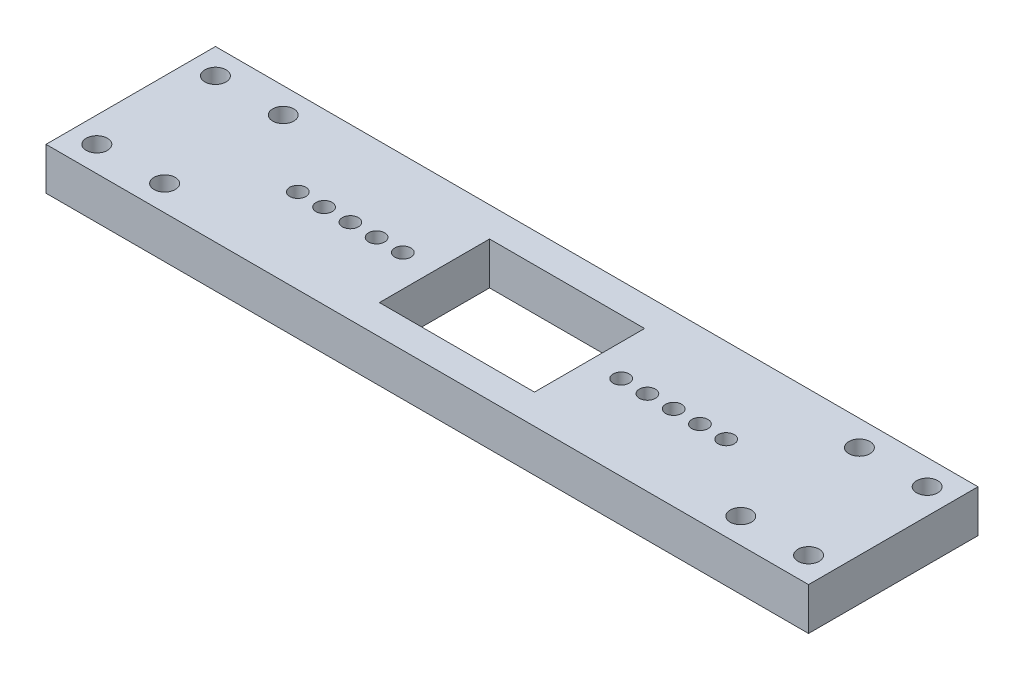
ISO-10303-21;
HEADER;
FILE_DESCRIPTION(('STEP AP214'),'2;1');
FILE_NAME('part.step','',(''),(''),'','','');
FILE_SCHEMA(('AUTOMOTIVE_DESIGN { 1 0 10303 214 1 1 1 1 }'));
ENDSEC;
DATA;
#1=APPLICATION_CONTEXT('core data for automotive mechanical design processes');
#2=APPLICATION_PROTOCOL_DEFINITION('international standard','automotive_design',2000,#1);
#3=PRODUCT_CONTEXT('',#1,'mechanical');
#4=PRODUCT('Part','Part','',(#3));
#5=PRODUCT_RELATED_PRODUCT_CATEGORY('part','',(#4));
#6=PRODUCT_DEFINITION_FORMATION('','',#4);
#7=PRODUCT_DEFINITION_CONTEXT('part definition',#1,'design');
#8=PRODUCT_DEFINITION('design','',#6,#7);
#9=PRODUCT_DEFINITION_SHAPE('','',#8);
#10=(LENGTH_UNIT() NAMED_UNIT(*) SI_UNIT(.MILLI.,.METRE.));
#11=(NAMED_UNIT(*) PLANE_ANGLE_UNIT() SI_UNIT($,.RADIAN.));
#12=(NAMED_UNIT(*) SI_UNIT($,.STERADIAN.) SOLID_ANGLE_UNIT());
#13=UNCERTAINTY_MEASURE_WITH_UNIT(LENGTH_MEASURE(1.E-05),#10,'distance_accuracy_value','');
#14=(GEOMETRIC_REPRESENTATION_CONTEXT(3) GLOBAL_UNCERTAINTY_ASSIGNED_CONTEXT((#13)) GLOBAL_UNIT_ASSIGNED_CONTEXT((#10,
#11,#12)) REPRESENTATION_CONTEXT('',''));
#15=CARTESIAN_POINT('',(0.,0.,0.));
#16=DIRECTION('',(0.,0.,1.));
#17=DIRECTION('',(1.,0.,0.));
#18=AXIS2_PLACEMENT_3D('',#15,#16,#17);
#19=CARTESIAN_POINT('',(0.,5.,0.));
#20=DIRECTION('',(0.,-1.,0.));
#21=DIRECTION('',(0.,0.,-1.));
#22=AXIS2_PLACEMENT_3D('',#19,#20,#21);
#23=PLANE('',#22);
#24=CARTESIAN_POINT('',(3.,5.,-17.));
#25=DIRECTION('',(0.,1.,0.));
#26=DIRECTION('',(0.,0.,1.));
#27=AXIS2_PLACEMENT_3D('',#24,#25,#26);
#28=CIRCLE('',#27,1.25);
#29=CARTESIAN_POINT('',(3.,5.,-15.75));
#30=VERTEX_POINT('',#29);
#31=EDGE_CURVE('E300',#30,#30,#28,.T.);
#32=ORIENTED_EDGE('',*,*,#31,.F.);
#33=EDGE_LOOP('',(#32));
#34=FACE_BOUND('',#33,.T.);
#35=CARTESIAN_POINT('',(87.,5.,-17.));
#36=DIRECTION('',(0.,1.,0.));
#37=DIRECTION('',(0.,0.,-1.));
#38=AXIS2_PLACEMENT_3D('',#35,#36,#37);
#39=CIRCLE('',#38,1.25);
#40=CARTESIAN_POINT('',(87.,5.,-18.25));
#41=VERTEX_POINT('',#40);
#42=EDGE_CURVE('E316',#41,#41,#39,.T.);
#43=ORIENTED_EDGE('',*,*,#42,.F.);
#44=EDGE_LOOP('',(#43));
#45=FACE_BOUND('',#44,.T.);
#46=CARTESIAN_POINT('',(79.,5.,-17.));
#47=DIRECTION('',(0.,1.,0.));
#48=DIRECTION('',(0.,0.,-1.));
#49=AXIS2_PLACEMENT_3D('',#46,#47,#48);
#50=CIRCLE('',#49,1.25);
#51=CARTESIAN_POINT('',(79.,5.,-18.25));
#52=VERTEX_POINT('',#51);
#53=EDGE_CURVE('E332',#52,#52,#50,.T.);
#54=ORIENTED_EDGE('',*,*,#53,.F.);
#55=EDGE_LOOP('',(#54));
#56=FACE_BOUND('',#55,.T.);
#57=CARTESIAN_POINT('',(79.,5.,-3.));
#58=DIRECTION('',(0.,1.,0.));
#59=DIRECTION('',(0.,0.,1.));
#60=AXIS2_PLACEMENT_3D('',#57,#58,#59);
#61=CIRCLE('',#60,1.25);
#62=CARTESIAN_POINT('',(79.,5.,-1.75));
#63=VERTEX_POINT('',#62);
#64=EDGE_CURVE('E325',#63,#63,#61,.T.);
#65=ORIENTED_EDGE('',*,*,#64,.F.);
#66=EDGE_LOOP('',(#65));
#67=FACE_BOUND('',#66,.T.);
#68=CARTESIAN_POINT('',(11.,5.,-17.));
#69=DIRECTION('',(0.,1.,0.));
#70=DIRECTION('',(0.,0.,1.));
#71=AXIS2_PLACEMENT_3D('',#68,#69,#70);
#72=CIRCLE('',#71,1.25);
#73=CARTESIAN_POINT('',(11.,5.,-15.75));
#74=VERTEX_POINT('',#73);
#75=EDGE_CURVE('E295',#74,#74,#72,.T.);
#76=ORIENTED_EDGE('',*,*,#75,.F.);
#77=EDGE_LOOP('',(#76));
#78=FACE_BOUND('',#77,.T.);
#79=CARTESIAN_POINT('',(11.,5.,-3.));
#80=DIRECTION('',(0.,1.,0.));
#81=DIRECTION('',(0.,0.,-1.));
#82=AXIS2_PLACEMENT_3D('',#79,#80,#81);
#83=CIRCLE('',#82,1.25);
#84=CARTESIAN_POINT('',(11.,5.,-4.25));
#85=VERTEX_POINT('',#84);
#86=EDGE_CURVE('E302',#85,#85,#83,.T.);
#87=ORIENTED_EDGE('',*,*,#86,.F.);
#88=EDGE_LOOP('',(#87));
#89=FACE_BOUND('',#88,.T.);
#90=CARTESIAN_POINT('',(3.,5.,-3.));
#91=DIRECTION('',(0.,1.,0.));
#92=DIRECTION('',(0.,0.,-1.));
#93=AXIS2_PLACEMENT_3D('',#90,#91,#92);
#94=CIRCLE('',#93,1.25);
#95=CARTESIAN_POINT('',(3.,5.,-4.25));
#96=VERTEX_POINT('',#95);
#97=EDGE_CURVE('E310',#96,#96,#94,.T.);
#98=ORIENTED_EDGE('',*,*,#97,.F.);
#99=EDGE_LOOP('',(#98));
#100=FACE_BOUND('',#99,.T.);
#101=CARTESIAN_POINT('',(87.,5.,-3.));
#102=DIRECTION('',(0.,1.,0.));
#103=DIRECTION('',(0.,0.,1.));
#104=AXIS2_PLACEMENT_3D('',#101,#102,#103);
#105=CIRCLE('',#104,1.25);
#106=CARTESIAN_POINT('',(87.,5.,-1.75));
#107=VERTEX_POINT('',#106);
#108=EDGE_CURVE('E337',#107,#107,#105,.T.);
#109=ORIENTED_EDGE('',*,*,#108,.F.);
#110=EDGE_LOOP('',(#109));
#111=FACE_BOUND('',#110,.T.);
#112=DIRECTION('',(0.,0.,1.));
#113=VECTOR('',#112,1.);
#114=CARTESIAN_POINT('',(0.,5.,0.));
#115=LINE('',#114,#113);
#116=CARTESIAN_POINT('',(0.,5.,-20.));
#117=VERTEX_POINT('',#116);
#118=CARTESIAN_POINT('',(0.,5.,0.));
#119=VERTEX_POINT('',#118);
#120=EDGE_CURVE('E136',#117,#119,#115,.T.);
#121=ORIENTED_EDGE('',*,*,#120,.T.);
#122=DIRECTION('',(1.,0.,0.));
#123=VECTOR('',#122,1.);
#124=CARTESIAN_POINT('',(0.,5.,0.));
#125=LINE('',#124,#123);
#126=CARTESIAN_POINT('',(90.,5.,0.));
#127=VERTEX_POINT('',#126);
#128=EDGE_CURVE('E139',#119,#127,#125,.T.);
#129=ORIENTED_EDGE('',*,*,#128,.T.);
#130=DIRECTION('',(0.,0.,-1.));
#131=VECTOR('',#130,1.);
#132=CARTESIAN_POINT('',(90.,5.,0.));
#133=LINE('',#132,#131);
#134=CARTESIAN_POINT('',(90.,5.,-20.));
#135=VERTEX_POINT('',#134);
#136=EDGE_CURVE('E142',#127,#135,#133,.T.);
#137=ORIENTED_EDGE('',*,*,#136,.T.);
#138=DIRECTION('',(-1.,0.,0.));
#139=VECTOR('',#138,1.);
#140=CARTESIAN_POINT('',(0.,5.,-20.));
#141=LINE('',#140,#139);
#142=EDGE_CURVE('E144',#135,#117,#141,.T.);
#143=ORIENTED_EDGE('',*,*,#142,.T.);
#144=EDGE_LOOP('',(#121,#129,#137,#143));
#145=FACE_BOUND('',#144,.T.);
#146=DIRECTION('',(0.,0.,-1.));
#147=VECTOR('',#146,1.);
#148=CARTESIAN_POINT('',(54.15,5.,-16.5));
#149=LINE('',#148,#147);
#150=CARTESIAN_POINT('',(54.15,5.,-3.5));
#151=VERTEX_POINT('',#150);
#152=CARTESIAN_POINT('',(54.15,5.,-16.5));
#153=VERTEX_POINT('',#152);
#154=EDGE_CURVE('E97',#151,#153,#149,.T.);
#155=ORIENTED_EDGE('',*,*,#154,.F.);
#156=DIRECTION('',(1.,0.,0.));
#157=VECTOR('',#156,1.);
#158=CARTESIAN_POINT('',(54.15,5.,-3.5));
#159=LINE('',#158,#157);
#160=CARTESIAN_POINT('',(35.85,5.,-3.5));
#161=VERTEX_POINT('',#160);
#162=EDGE_CURVE('E120',#161,#151,#159,.T.);
#163=ORIENTED_EDGE('',*,*,#162,.F.);
#164=DIRECTION('',(0.,0.,1.));
#165=VECTOR('',#164,1.);
#166=CARTESIAN_POINT('',(35.85,5.,-16.5));
#167=LINE('',#166,#165);
#168=CARTESIAN_POINT('',(35.85,5.,-16.5));
#169=VERTEX_POINT('',#168);
#170=EDGE_CURVE('E118',#169,#161,#167,.T.);
#171=ORIENTED_EDGE('',*,*,#170,.F.);
#172=DIRECTION('',(-1.,0.,0.));
#173=VECTOR('',#172,1.);
#174=CARTESIAN_POINT('',(54.15,5.,-16.5));
#175=LINE('',#174,#173);
#176=EDGE_CURVE('E105',#153,#169,#175,.T.);
#177=ORIENTED_EDGE('',*,*,#176,.F.);
#178=EDGE_LOOP('',(#155,#163,#171,#177));
#179=FACE_BOUND('',#178,.T.);
#180=CARTESIAN_POINT('',(57.88,5.,-10.));
#181=DIRECTION('',(0.,1.,0.));
#182=DIRECTION('',(0.,0.,1.));
#183=AXIS2_PLACEMENT_3D('',#180,#181,#182);
#184=CIRCLE('',#183,0.950000000000001);
#185=CARTESIAN_POINT('',(57.88,5.,-9.05));
#186=VERTEX_POINT('',#185);
#187=EDGE_CURVE('E126',#186,#186,#184,.T.);
#188=ORIENTED_EDGE('',*,*,#187,.F.);
#189=EDGE_LOOP('',(#188));
#190=FACE_BOUND('',#189,.T.);
#191=CARTESIAN_POINT('',(60.98,5.,-10.));
#192=DIRECTION('',(0.,1.,0.));
#193=DIRECTION('',(0.,0.,1.));
#194=AXIS2_PLACEMENT_3D('',#191,#192,#193);
#195=CIRCLE('',#194,0.950000000000001);
#196=CARTESIAN_POINT('',(60.98,5.,-9.05));
#197=VERTEX_POINT('',#196);
#198=EDGE_CURVE('E391',#197,#197,#195,.T.);
#199=ORIENTED_EDGE('',*,*,#198,.F.);
#200=EDGE_LOOP('',(#199));
#201=FACE_BOUND('',#200,.T.);
#202=CARTESIAN_POINT('',(64.08,5.,-10.));
#203=DIRECTION('',(0.,1.,0.));
#204=DIRECTION('',(0.,0.,1.));
#205=AXIS2_PLACEMENT_3D('',#202,#203,#204);
#206=CIRCLE('',#205,0.950000000000001);
#207=CARTESIAN_POINT('',(64.08,5.,-9.05));
#208=VERTEX_POINT('',#207);
#209=EDGE_CURVE('E385',#208,#208,#206,.T.);
#210=ORIENTED_EDGE('',*,*,#209,.F.);
#211=EDGE_LOOP('',(#210));
#212=FACE_BOUND('',#211,.T.);
#213=CARTESIAN_POINT('',(67.18,5.,-10.));
#214=DIRECTION('',(0.,1.,0.));
#215=DIRECTION('',(0.,0.,1.));
#216=AXIS2_PLACEMENT_3D('',#213,#214,#215);
#217=CIRCLE('',#216,0.950000000000001);
#218=CARTESIAN_POINT('',(67.18,5.,-9.05));
#219=VERTEX_POINT('',#218);
#220=EDGE_CURVE('E379',#219,#219,#217,.T.);
#221=ORIENTED_EDGE('',*,*,#220,.F.);
#222=EDGE_LOOP('',(#221));
#223=FACE_BOUND('',#222,.T.);
#224=CARTESIAN_POINT('',(70.28,5.,-10.));
#225=DIRECTION('',(0.,1.,0.));
#226=DIRECTION('',(0.,0.,1.));
#227=AXIS2_PLACEMENT_3D('',#224,#225,#226);
#228=CIRCLE('',#227,0.950000000000001);
#229=CARTESIAN_POINT('',(70.28,5.,-9.05));
#230=VERTEX_POINT('',#229);
#231=EDGE_CURVE('E373',#230,#230,#228,.T.);
#232=ORIENTED_EDGE('',*,*,#231,.F.);
#233=EDGE_LOOP('',(#232));
#234=FACE_BOUND('',#233,.T.);
#235=CARTESIAN_POINT('',(19.72,5.,-10.));
#236=DIRECTION('',(0.,1.,0.));
#237=DIRECTION('',(0.,0.,-1.));
#238=AXIS2_PLACEMENT_3D('',#235,#236,#237);
#239=CIRCLE('',#238,0.950000000000001);
#240=CARTESIAN_POINT('',(19.72,5.,-10.95));
#241=VERTEX_POINT('',#240);
#242=EDGE_CURVE('E367',#241,#241,#239,.T.);
#243=ORIENTED_EDGE('',*,*,#242,.F.);
#244=EDGE_LOOP('',(#243));
#245=FACE_BOUND('',#244,.T.);
#246=CARTESIAN_POINT('',(22.82,5.,-10.));
#247=DIRECTION('',(0.,1.,0.));
#248=DIRECTION('',(0.,0.,-1.));
#249=AXIS2_PLACEMENT_3D('',#246,#247,#248);
#250=CIRCLE('',#249,0.950000000000001);
#251=CARTESIAN_POINT('',(22.82,5.,-10.95));
#252=VERTEX_POINT('',#251);
#253=EDGE_CURVE('E361',#252,#252,#250,.T.);
#254=ORIENTED_EDGE('',*,*,#253,.F.);
#255=EDGE_LOOP('',(#254));
#256=FACE_BOUND('',#255,.T.);
#257=CARTESIAN_POINT('',(25.92,5.,-10.));
#258=DIRECTION('',(0.,1.,0.));
#259=DIRECTION('',(0.,0.,-1.));
#260=AXIS2_PLACEMENT_3D('',#257,#258,#259);
#261=CIRCLE('',#260,0.950000000000001);
#262=CARTESIAN_POINT('',(25.92,5.,-10.95));
#263=VERTEX_POINT('',#262);
#264=EDGE_CURVE('E355',#263,#263,#261,.T.);
#265=ORIENTED_EDGE('',*,*,#264,.F.);
#266=EDGE_LOOP('',(#265));
#267=FACE_BOUND('',#266,.T.);
#268=CARTESIAN_POINT('',(29.02,5.,-10.));
#269=DIRECTION('',(0.,1.,0.));
#270=DIRECTION('',(0.,0.,-1.));
#271=AXIS2_PLACEMENT_3D('',#268,#269,#270);
#272=CIRCLE('',#271,0.950000000000001);
#273=CARTESIAN_POINT('',(29.02,5.,-10.95));
#274=VERTEX_POINT('',#273);
#275=EDGE_CURVE('E349',#274,#274,#272,.T.);
#276=ORIENTED_EDGE('',*,*,#275,.F.);
#277=EDGE_LOOP('',(#276));
#278=FACE_BOUND('',#277,.T.);
#279=CARTESIAN_POINT('',(32.12,5.,-10.));
#280=DIRECTION('',(0.,1.,0.));
#281=DIRECTION('',(0.,0.,-1.));
#282=AXIS2_PLACEMENT_3D('',#279,#280,#281);
#283=CIRCLE('',#282,0.950000000000001);
#284=CARTESIAN_POINT('',(32.12,5.,-10.95));
#285=VERTEX_POINT('',#284);
#286=EDGE_CURVE('E343',#285,#285,#283,.T.);
#287=ORIENTED_EDGE('',*,*,#286,.F.);
#288=EDGE_LOOP('',(#287));
#289=FACE_BOUND('',#288,.T.);
#290=ADVANCED_FACE('F32',(#34,#45,#56,#67,#78,#89,#100,#111,#145,#179,#190,#201,#212,#223,#234,
#245,#256,#267,#278,#289),#23,.F.);
#291=CARTESIAN_POINT('',(0.,0.,0.));
#292=DIRECTION('',(0.,-1.,0.));
#293=DIRECTION('',(0.,0.,-1.));
#294=AXIS2_PLACEMENT_3D('',#291,#292,#293);
#295=PLANE('',#294);
#296=CARTESIAN_POINT('',(3.,0.,-17.));
#297=DIRECTION('',(0.,-1.,0.));
#298=DIRECTION('',(0.,0.,-1.));
#299=AXIS2_PLACEMENT_3D('',#296,#297,#298);
#300=CIRCLE('',#299,1.25);
#301=CARTESIAN_POINT('',(3.,0.,-18.25));
#302=VERTEX_POINT('',#301);
#303=EDGE_CURVE('E297',#302,#302,#300,.F.);
#304=ORIENTED_EDGE('',*,*,#303,.T.);
#305=EDGE_LOOP('',(#304));
#306=FACE_BOUND('',#305,.T.);
#307=CARTESIAN_POINT('',(87.,0.,-17.));
#308=DIRECTION('',(0.,-1.,0.));
#309=DIRECTION('',(0.,0.,-1.));
#310=AXIS2_PLACEMENT_3D('',#307,#308,#309);
#311=CIRCLE('',#310,1.25);
#312=CARTESIAN_POINT('',(87.,0.,-18.25));
#313=VERTEX_POINT('',#312);
#314=EDGE_CURVE('E320',#313,#313,#311,.F.);
#315=ORIENTED_EDGE('',*,*,#314,.T.);
#316=EDGE_LOOP('',(#315));
#317=FACE_BOUND('',#316,.T.);
#318=CARTESIAN_POINT('',(79.,0.,-17.));
#319=DIRECTION('',(0.,-1.,0.));
#320=DIRECTION('',(0.,0.,-1.));
#321=AXIS2_PLACEMENT_3D('',#318,#319,#320);
#322=CIRCLE('',#321,1.25);
#323=CARTESIAN_POINT('',(79.,0.,-18.25));
#324=VERTEX_POINT('',#323);
#325=EDGE_CURVE('E319',#324,#324,#322,.F.);
#326=ORIENTED_EDGE('',*,*,#325,.T.);
#327=EDGE_LOOP('',(#326));
#328=FACE_BOUND('',#327,.T.);
#329=CARTESIAN_POINT('',(79.,0.,-3.));
#330=DIRECTION('',(0.,-1.,0.));
#331=DIRECTION('',(0.,0.,-1.));
#332=AXIS2_PLACEMENT_3D('',#329,#330,#331);
#333=CIRCLE('',#332,1.25);
#334=CARTESIAN_POINT('',(79.,0.,-4.25));
#335=VERTEX_POINT('',#334);
#336=EDGE_CURVE('E329',#335,#335,#333,.F.);
#337=ORIENTED_EDGE('',*,*,#336,.T.);
#338=EDGE_LOOP('',(#337));
#339=FACE_BOUND('',#338,.T.);
#340=CARTESIAN_POINT('',(11.,0.,-17.));
#341=DIRECTION('',(0.,-1.,0.));
#342=DIRECTION('',(0.,0.,-1.));
#343=AXIS2_PLACEMENT_3D('',#340,#341,#342);
#344=CIRCLE('',#343,1.25);
#345=CARTESIAN_POINT('',(11.,0.,-18.25));
#346=VERTEX_POINT('',#345);
#347=EDGE_CURVE('E292',#346,#346,#344,.F.);
#348=ORIENTED_EDGE('',*,*,#347,.T.);
#349=EDGE_LOOP('',(#348));
#350=FACE_BOUND('',#349,.T.);
#351=CARTESIAN_POINT('',(11.,0.,-3.));
#352=DIRECTION('',(0.,-1.,0.));
#353=DIRECTION('',(0.,0.,-1.));
#354=AXIS2_PLACEMENT_3D('',#351,#352,#353);
#355=CIRCLE('',#354,1.25);
#356=CARTESIAN_POINT('',(11.,0.,-4.25));
#357=VERTEX_POINT('',#356);
#358=EDGE_CURVE('E307',#357,#357,#355,.F.);
#359=ORIENTED_EDGE('',*,*,#358,.T.);
#360=EDGE_LOOP('',(#359));
#361=FACE_BOUND('',#360,.T.);
#362=CARTESIAN_POINT('',(3.,0.,-3.));
#363=DIRECTION('',(0.,-1.,0.));
#364=DIRECTION('',(0.,0.,-1.));
#365=AXIS2_PLACEMENT_3D('',#362,#363,#364);
#366=CIRCLE('',#365,1.25);
#367=CARTESIAN_POINT('',(3.,0.,-4.25));
#368=VERTEX_POINT('',#367);
#369=EDGE_CURVE('E313',#368,#368,#366,.F.);
#370=ORIENTED_EDGE('',*,*,#369,.T.);
#371=EDGE_LOOP('',(#370));
#372=FACE_BOUND('',#371,.T.);
#373=CARTESIAN_POINT('',(87.,0.,-3.));
#374=DIRECTION('',(0.,-1.,0.));
#375=DIRECTION('',(0.,0.,-1.));
#376=AXIS2_PLACEMENT_3D('',#373,#374,#375);
#377=CIRCLE('',#376,1.25);
#378=CARTESIAN_POINT('',(87.,0.,-4.25));
#379=VERTEX_POINT('',#378);
#380=EDGE_CURVE('E328',#379,#379,#377,.F.);
#381=ORIENTED_EDGE('',*,*,#380,.T.);
#382=EDGE_LOOP('',(#381));
#383=FACE_BOUND('',#382,.T.);
#384=CARTESIAN_POINT('',(29.02,0.,-10.));
#385=DIRECTION('',(0.,1.,0.));
#386=DIRECTION('',(0.,0.,-1.));
#387=AXIS2_PLACEMENT_3D('',#384,#385,#386);
#388=CIRCLE('',#387,0.950000000000001);
#389=CARTESIAN_POINT('',(29.02,0.,-10.95));
#390=VERTEX_POINT('',#389);
#391=EDGE_CURVE('E346',#390,#390,#388,.T.);
#392=ORIENTED_EDGE('',*,*,#391,.T.);
#393=EDGE_LOOP('',(#392));
#394=FACE_BOUND('',#393,.T.);
#395=CARTESIAN_POINT('',(22.82,0.,-10.));
#396=DIRECTION('',(0.,1.,0.));
#397=DIRECTION('',(0.,0.,-1.));
#398=AXIS2_PLACEMENT_3D('',#395,#396,#397);
#399=CIRCLE('',#398,0.950000000000001);
#400=CARTESIAN_POINT('',(22.82,0.,-10.95));
#401=VERTEX_POINT('',#400);
#402=EDGE_CURVE('E358',#401,#401,#399,.T.);
#403=ORIENTED_EDGE('',*,*,#402,.T.);
#404=EDGE_LOOP('',(#403));
#405=FACE_BOUND('',#404,.T.);
#406=CARTESIAN_POINT('',(70.28,0.,-10.));
#407=DIRECTION('',(0.,1.,0.));
#408=DIRECTION('',(0.,0.,1.));
#409=AXIS2_PLACEMENT_3D('',#406,#407,#408);
#410=CIRCLE('',#409,0.950000000000001);
#411=CARTESIAN_POINT('',(70.28,0.,-9.05));
#412=VERTEX_POINT('',#411);
#413=EDGE_CURVE('E370',#412,#412,#410,.T.);
#414=ORIENTED_EDGE('',*,*,#413,.T.);
#415=EDGE_LOOP('',(#414));
#416=FACE_BOUND('',#415,.T.);
#417=CARTESIAN_POINT('',(64.08,0.,-10.));
#418=DIRECTION('',(0.,1.,0.));
#419=DIRECTION('',(0.,0.,1.));
#420=AXIS2_PLACEMENT_3D('',#417,#418,#419);
#421=CIRCLE('',#420,0.950000000000001);
#422=CARTESIAN_POINT('',(64.08,0.,-9.05));
#423=VERTEX_POINT('',#422);
#424=EDGE_CURVE('E382',#423,#423,#421,.T.);
#425=ORIENTED_EDGE('',*,*,#424,.T.);
#426=EDGE_LOOP('',(#425));
#427=FACE_BOUND('',#426,.T.);
#428=CARTESIAN_POINT('',(57.88,0.,-10.));
#429=DIRECTION('',(0.,1.,0.));
#430=DIRECTION('',(0.,0.,1.));
#431=AXIS2_PLACEMENT_3D('',#428,#429,#430);
#432=CIRCLE('',#431,0.950000000000001);
#433=CARTESIAN_POINT('',(57.88,0.,-9.05));
#434=VERTEX_POINT('',#433);
#435=EDGE_CURVE('E394',#434,#434,#432,.T.);
#436=ORIENTED_EDGE('',*,*,#435,.T.);
#437=EDGE_LOOP('',(#436));
#438=FACE_BOUND('',#437,.T.);
#439=DIRECTION('',(0.,0.,1.));
#440=VECTOR('',#439,1.);
#441=CARTESIAN_POINT('',(0.,0.,0.));
#442=LINE('',#441,#440);
#443=CARTESIAN_POINT('',(0.,0.,-20.));
#444=VERTEX_POINT('',#443);
#445=CARTESIAN_POINT('',(0.,0.,0.));
#446=VERTEX_POINT('',#445);
#447=EDGE_CURVE('E113',#444,#446,#442,.T.);
#448=ORIENTED_EDGE('',*,*,#447,.F.);
#449=DIRECTION('',(-1.,0.,0.));
#450=VECTOR('',#449,1.);
#451=CARTESIAN_POINT('',(0.,0.,-20.));
#452=LINE('',#451,#450);
#453=CARTESIAN_POINT('',(90.,0.,-20.));
#454=VERTEX_POINT('',#453);
#455=EDGE_CURVE('E140',#454,#444,#452,.T.);
#456=ORIENTED_EDGE('',*,*,#455,.F.);
#457=DIRECTION('',(0.,0.,-1.));
#458=VECTOR('',#457,1.);
#459=CARTESIAN_POINT('',(90.,0.,0.));
#460=LINE('',#459,#458);
#461=CARTESIAN_POINT('',(90.,0.,0.));
#462=VERTEX_POINT('',#461);
#463=EDGE_CURVE('E151',#462,#454,#460,.T.);
#464=ORIENTED_EDGE('',*,*,#463,.F.);
#465=DIRECTION('',(1.,0.,0.));
#466=VECTOR('',#465,1.);
#467=CARTESIAN_POINT('',(0.,0.,0.));
#468=LINE('',#467,#466);
#469=EDGE_CURVE('E149',#446,#462,#468,.T.);
#470=ORIENTED_EDGE('',*,*,#469,.F.);
#471=EDGE_LOOP('',(#448,#456,#464,#470));
#472=FACE_BOUND('',#471,.T.);
#473=DIRECTION('',(1.,0.,0.));
#474=VECTOR('',#473,1.);
#475=CARTESIAN_POINT('',(54.15,0.,-3.5));
#476=LINE('',#475,#474);
#477=CARTESIAN_POINT('',(35.85,0.,-3.5));
#478=VERTEX_POINT('',#477);
#479=CARTESIAN_POINT('',(54.15,0.,-3.5));
#480=VERTEX_POINT('',#479);
#481=EDGE_CURVE('E106',#478,#480,#476,.T.);
#482=ORIENTED_EDGE('',*,*,#481,.T.);
#483=DIRECTION('',(0.,0.,-1.));
#484=VECTOR('',#483,1.);
#485=CARTESIAN_POINT('',(54.15,0.,-16.5));
#486=LINE('',#485,#484);
#487=CARTESIAN_POINT('',(54.15,0.,-16.5));
#488=VERTEX_POINT('',#487);
#489=EDGE_CURVE('E55',#480,#488,#486,.T.);
#490=ORIENTED_EDGE('',*,*,#489,.T.);
#491=DIRECTION('',(-1.,0.,0.));
#492=VECTOR('',#491,1.);
#493=CARTESIAN_POINT('',(54.15,0.,-16.5));
#494=LINE('',#493,#492);
#495=CARTESIAN_POINT('',(35.85,0.,-16.5));
#496=VERTEX_POINT('',#495);
#497=EDGE_CURVE('E112',#488,#496,#494,.T.);
#498=ORIENTED_EDGE('',*,*,#497,.T.);
#499=DIRECTION('',(0.,0.,1.));
#500=VECTOR('',#499,1.);
#501=CARTESIAN_POINT('',(35.85,0.,-16.5));
#502=LINE('',#501,#500);
#503=EDGE_CURVE('E128',#496,#478,#502,.T.);
#504=ORIENTED_EDGE('',*,*,#503,.T.);
#505=EDGE_LOOP('',(#482,#490,#498,#504));
#506=FACE_BOUND('',#505,.T.);
#507=CARTESIAN_POINT('',(60.98,0.,-10.));
#508=DIRECTION('',(0.,1.,0.));
#509=DIRECTION('',(0.,0.,1.));
#510=AXIS2_PLACEMENT_3D('',#507,#508,#509);
#511=CIRCLE('',#510,0.950000000000001);
#512=CARTESIAN_POINT('',(60.98,0.,-9.05));
#513=VERTEX_POINT('',#512);
#514=EDGE_CURVE('E388',#513,#513,#511,.T.);
#515=ORIENTED_EDGE('',*,*,#514,.T.);
#516=EDGE_LOOP('',(#515));
#517=FACE_BOUND('',#516,.T.);
#518=CARTESIAN_POINT('',(67.18,0.,-10.));
#519=DIRECTION('',(0.,1.,0.));
#520=DIRECTION('',(0.,0.,1.));
#521=AXIS2_PLACEMENT_3D('',#518,#519,#520);
#522=CIRCLE('',#521,0.950000000000001);
#523=CARTESIAN_POINT('',(67.18,0.,-9.05));
#524=VERTEX_POINT('',#523);
#525=EDGE_CURVE('E376',#524,#524,#522,.T.);
#526=ORIENTED_EDGE('',*,*,#525,.T.);
#527=EDGE_LOOP('',(#526));
#528=FACE_BOUND('',#527,.T.);
#529=CARTESIAN_POINT('',(19.72,0.,-10.));
#530=DIRECTION('',(0.,1.,0.));
#531=DIRECTION('',(0.,0.,-1.));
#532=AXIS2_PLACEMENT_3D('',#529,#530,#531);
#533=CIRCLE('',#532,0.950000000000001);
#534=CARTESIAN_POINT('',(19.72,0.,-10.95));
#535=VERTEX_POINT('',#534);
#536=EDGE_CURVE('E364',#535,#535,#533,.T.);
#537=ORIENTED_EDGE('',*,*,#536,.T.);
#538=EDGE_LOOP('',(#537));
#539=FACE_BOUND('',#538,.T.);
#540=CARTESIAN_POINT('',(25.92,0.,-10.));
#541=DIRECTION('',(0.,1.,0.));
#542=DIRECTION('',(0.,0.,-1.));
#543=AXIS2_PLACEMENT_3D('',#540,#541,#542);
#544=CIRCLE('',#543,0.950000000000001);
#545=CARTESIAN_POINT('',(25.92,0.,-10.95));
#546=VERTEX_POINT('',#545);
#547=EDGE_CURVE('E352',#546,#546,#544,.T.);
#548=ORIENTED_EDGE('',*,*,#547,.T.);
#549=EDGE_LOOP('',(#548));
#550=FACE_BOUND('',#549,.T.);
#551=CARTESIAN_POINT('',(32.12,0.,-10.));
#552=DIRECTION('',(0.,1.,0.));
#553=DIRECTION('',(0.,0.,-1.));
#554=AXIS2_PLACEMENT_3D('',#551,#552,#553);
#555=CIRCLE('',#554,0.950000000000001);
#556=CARTESIAN_POINT('',(32.12,0.,-10.95));
#557=VERTEX_POINT('',#556);
#558=EDGE_CURVE('E340',#557,#557,#555,.T.);
#559=ORIENTED_EDGE('',*,*,#558,.T.);
#560=EDGE_LOOP('',(#559));
#561=FACE_BOUND('',#560,.T.);
#562=ADVANCED_FACE('F169',(#306,#317,#328,#339,#350,#361,#372,#383,#394,#405,#416,#427,#438,
#472,#506,#517,#528,#539,#550,#561),#295,.T.);
#563=CARTESIAN_POINT('',(0.,5.,0.));
#564=DIRECTION('',(1.,0.,0.));
#565=DIRECTION('',(0.,0.,-1.));
#566=AXIS2_PLACEMENT_3D('',#563,#564,#565);
#567=PLANE('',#566);
#568=ORIENTED_EDGE('',*,*,#447,.T.);
#569=DIRECTION('',(0.,-1.,0.));
#570=VECTOR('',#569,1.);
#571=CARTESIAN_POINT('',(0.,5.,0.));
#572=LINE('',#571,#570);
#573=EDGE_CURVE('E11',#119,#446,#572,.T.);
#574=ORIENTED_EDGE('',*,*,#573,.F.);
#575=ORIENTED_EDGE('',*,*,#120,.F.);
#576=DIRECTION('',(0.,-1.,0.));
#577=VECTOR('',#576,1.);
#578=CARTESIAN_POINT('',(0.,5.,-20.));
#579=LINE('',#578,#577);
#580=EDGE_CURVE('E146',#117,#444,#579,.T.);
#581=ORIENTED_EDGE('',*,*,#580,.T.);
#582=EDGE_LOOP('',(#568,#574,#575,#581));
#583=FACE_BOUND('',#582,.T.);
#584=ADVANCED_FACE('F34',(#583),#567,.F.);
#585=CARTESIAN_POINT('',(0.,5.,0.));
#586=DIRECTION('',(0.,0.,-1.));
#587=DIRECTION('',(-1.,0.,0.));
#588=AXIS2_PLACEMENT_3D('',#585,#586,#587);
#589=PLANE('',#588);
#590=ORIENTED_EDGE('',*,*,#469,.T.);
#591=DIRECTION('',(0.,-1.,0.));
#592=VECTOR('',#591,1.);
#593=CARTESIAN_POINT('',(90.,5.,0.));
#594=LINE('',#593,#592);
#595=EDGE_CURVE('E40',#127,#462,#594,.T.);
#596=ORIENTED_EDGE('',*,*,#595,.F.);
#597=ORIENTED_EDGE('',*,*,#128,.F.);
#598=ORIENTED_EDGE('',*,*,#573,.T.);
#599=EDGE_LOOP('',(#590,#596,#597,#598));
#600=FACE_BOUND('',#599,.T.);
#601=ADVANCED_FACE('F179',(#600),#589,.F.);
#602=CARTESIAN_POINT('',(90.,5.,0.));
#603=DIRECTION('',(-1.,0.,0.));
#604=DIRECTION('',(0.,0.,1.));
#605=AXIS2_PLACEMENT_3D('',#602,#603,#604);
#606=PLANE('',#605);
#607=ORIENTED_EDGE('',*,*,#463,.T.);
#608=DIRECTION('',(0.,-1.,0.));
#609=VECTOR('',#608,1.);
#610=CARTESIAN_POINT('',(90.,5.,-20.));
#611=LINE('',#610,#609);
#612=EDGE_CURVE('E156',#135,#454,#611,.T.);
#613=ORIENTED_EDGE('',*,*,#612,.F.);
#614=ORIENTED_EDGE('',*,*,#136,.F.);
#615=ORIENTED_EDGE('',*,*,#595,.T.);
#616=EDGE_LOOP('',(#607,#613,#614,#615));
#617=FACE_BOUND('',#616,.T.);
#618=ADVANCED_FACE('F163',(#617),#606,.F.);
#619=CARTESIAN_POINT('',(0.,5.,-20.));
#620=DIRECTION('',(0.,0.,1.));
#621=DIRECTION('',(1.,0.,0.));
#622=AXIS2_PLACEMENT_3D('',#619,#620,#621);
#623=PLANE('',#622);
#624=ORIENTED_EDGE('',*,*,#455,.T.);
#625=ORIENTED_EDGE('',*,*,#580,.F.);
#626=ORIENTED_EDGE('',*,*,#142,.F.);
#627=ORIENTED_EDGE('',*,*,#612,.T.);
#628=EDGE_LOOP('',(#624,#625,#626,#627));
#629=FACE_BOUND('',#628,.T.);
#630=ADVANCED_FACE('F173',(#629),#623,.F.);
#631=CARTESIAN_POINT('',(54.15,5.,-16.5));
#632=DIRECTION('',(-1.,0.,0.));
#633=DIRECTION('',(0.,0.,1.));
#634=AXIS2_PLACEMENT_3D('',#631,#632,#633);
#635=PLANE('',#634);
#636=ORIENTED_EDGE('',*,*,#489,.F.);
#637=DIRECTION('',(0.,-1.,0.));
#638=VECTOR('',#637,1.);
#639=CARTESIAN_POINT('',(54.15,5.,-3.5));
#640=LINE('',#639,#638);
#641=EDGE_CURVE('E101',#151,#480,#640,.T.);
#642=ORIENTED_EDGE('',*,*,#641,.F.);
#643=ORIENTED_EDGE('',*,*,#154,.T.);
#644=DIRECTION('',(0.,-1.,0.));
#645=VECTOR('',#644,1.);
#646=CARTESIAN_POINT('',(54.15,5.,-16.5));
#647=LINE('',#646,#645);
#648=EDGE_CURVE('E100',#153,#488,#647,.T.);
#649=ORIENTED_EDGE('',*,*,#648,.T.);
#650=EDGE_LOOP('',(#636,#642,#643,#649));
#651=FACE_BOUND('',#650,.T.);
#652=ADVANCED_FACE('F99',(#651),#635,.T.);
#653=CARTESIAN_POINT('',(54.15,5.,-16.5));
#654=DIRECTION('',(0.,0.,1.));
#655=DIRECTION('',(1.,0.,0.));
#656=AXIS2_PLACEMENT_3D('',#653,#654,#655);
#657=PLANE('',#656);
#658=ORIENTED_EDGE('',*,*,#497,.F.);
#659=ORIENTED_EDGE('',*,*,#648,.F.);
#660=ORIENTED_EDGE('',*,*,#176,.T.);
#661=DIRECTION('',(0.,-1.,0.));
#662=VECTOR('',#661,1.);
#663=CARTESIAN_POINT('',(35.85,5.,-16.5));
#664=LINE('',#663,#662);
#665=EDGE_CURVE('E114',#169,#496,#664,.T.);
#666=ORIENTED_EDGE('',*,*,#665,.T.);
#667=EDGE_LOOP('',(#658,#659,#660,#666));
#668=FACE_BOUND('',#667,.T.);
#669=ADVANCED_FACE('F109',(#668),#657,.T.);
#670=CARTESIAN_POINT('',(35.85,5.,-16.5));
#671=DIRECTION('',(1.,0.,0.));
#672=DIRECTION('',(0.,0.,-1.));
#673=AXIS2_PLACEMENT_3D('',#670,#671,#672);
#674=PLANE('',#673);
#675=ORIENTED_EDGE('',*,*,#503,.F.);
#676=ORIENTED_EDGE('',*,*,#665,.F.);
#677=ORIENTED_EDGE('',*,*,#170,.T.);
#678=DIRECTION('',(0.,-1.,0.));
#679=VECTOR('',#678,1.);
#680=CARTESIAN_POINT('',(35.85,5.,-3.5));
#681=LINE('',#680,#679);
#682=EDGE_CURVE('E47',#161,#478,#681,.T.);
#683=ORIENTED_EDGE('',*,*,#682,.T.);
#684=EDGE_LOOP('',(#675,#676,#677,#683));
#685=FACE_BOUND('',#684,.T.);
#686=ADVANCED_FACE('F206',(#685),#674,.T.);
#687=CARTESIAN_POINT('',(54.15,5.,-3.5));
#688=DIRECTION('',(0.,0.,-1.));
#689=DIRECTION('',(-1.,0.,0.));
#690=AXIS2_PLACEMENT_3D('',#687,#688,#689);
#691=PLANE('',#690);
#692=ORIENTED_EDGE('',*,*,#481,.F.);
#693=ORIENTED_EDGE('',*,*,#682,.F.);
#694=ORIENTED_EDGE('',*,*,#162,.T.);
#695=ORIENTED_EDGE('',*,*,#641,.T.);
#696=EDGE_LOOP('',(#692,#693,#694,#695));
#697=FACE_BOUND('',#696,.T.);
#698=ADVANCED_FACE('F210',(#697),#691,.T.);
#699=CARTESIAN_POINT('',(57.88,5.,-10.));
#700=DIRECTION('',(0.,-1.,0.));
#701=DIRECTION('',(0.,0.,-1.));
#702=AXIS2_PLACEMENT_3D('',#699,#700,#701);
#703=CYLINDRICAL_SURFACE('',#702,0.950000000000001);
#704=ORIENTED_EDGE('',*,*,#187,.T.);
#705=EDGE_LOOP('',(#704));
#706=FACE_BOUND('',#705,.T.);
#707=ORIENTED_EDGE('',*,*,#435,.F.);
#708=EDGE_LOOP('',(#707));
#709=FACE_BOUND('',#708,.T.);
#710=ADVANCED_FACE('F216',(#706,#709),#703,.F.);
#711=CARTESIAN_POINT('',(60.98,5.,-10.));
#712=DIRECTION('',(0.,-1.,0.));
#713=DIRECTION('',(0.,0.,-1.));
#714=AXIS2_PLACEMENT_3D('',#711,#712,#713);
#715=CYLINDRICAL_SURFACE('',#714,0.950000000000001);
#716=ORIENTED_EDGE('',*,*,#198,.T.);
#717=EDGE_LOOP('',(#716));
#718=FACE_BOUND('',#717,.T.);
#719=ORIENTED_EDGE('',*,*,#514,.F.);
#720=EDGE_LOOP('',(#719));
#721=FACE_BOUND('',#720,.T.);
#722=ADVANCED_FACE('F219',(#718,#721),#715,.F.);
#723=CARTESIAN_POINT('',(64.08,5.,-10.));
#724=DIRECTION('',(0.,-1.,0.));
#725=DIRECTION('',(0.,0.,-1.));
#726=AXIS2_PLACEMENT_3D('',#723,#724,#725);
#727=CYLINDRICAL_SURFACE('',#726,0.950000000000001);
#728=ORIENTED_EDGE('',*,*,#209,.T.);
#729=EDGE_LOOP('',(#728));
#730=FACE_BOUND('',#729,.T.);
#731=ORIENTED_EDGE('',*,*,#424,.F.);
#732=EDGE_LOOP('',(#731));
#733=FACE_BOUND('',#732,.T.);
#734=ADVANCED_FACE('F223',(#730,#733),#727,.F.);
#735=CARTESIAN_POINT('',(67.18,5.,-10.));
#736=DIRECTION('',(0.,-1.,0.));
#737=DIRECTION('',(0.,0.,-1.));
#738=AXIS2_PLACEMENT_3D('',#735,#736,#737);
#739=CYLINDRICAL_SURFACE('',#738,0.950000000000001);
#740=ORIENTED_EDGE('',*,*,#220,.T.);
#741=EDGE_LOOP('',(#740));
#742=FACE_BOUND('',#741,.T.);
#743=ORIENTED_EDGE('',*,*,#525,.F.);
#744=EDGE_LOOP('',(#743));
#745=FACE_BOUND('',#744,.T.);
#746=ADVANCED_FACE('F227',(#742,#745),#739,.F.);
#747=CARTESIAN_POINT('',(70.28,5.,-10.));
#748=DIRECTION('',(0.,-1.,0.));
#749=DIRECTION('',(0.,0.,-1.));
#750=AXIS2_PLACEMENT_3D('',#747,#748,#749);
#751=CYLINDRICAL_SURFACE('',#750,0.950000000000001);
#752=ORIENTED_EDGE('',*,*,#231,.T.);
#753=EDGE_LOOP('',(#752));
#754=FACE_BOUND('',#753,.T.);
#755=ORIENTED_EDGE('',*,*,#413,.F.);
#756=EDGE_LOOP('',(#755));
#757=FACE_BOUND('',#756,.T.);
#758=ADVANCED_FACE('F231',(#754,#757),#751,.F.);
#759=CARTESIAN_POINT('',(19.72,5.,-10.));
#760=DIRECTION('',(0.,-1.,0.));
#761=DIRECTION('',(0.,0.,-1.));
#762=AXIS2_PLACEMENT_3D('',#759,#760,#761);
#763=CYLINDRICAL_SURFACE('',#762,0.950000000000001);
#764=ORIENTED_EDGE('',*,*,#242,.T.);
#765=EDGE_LOOP('',(#764));
#766=FACE_BOUND('',#765,.T.);
#767=ORIENTED_EDGE('',*,*,#536,.F.);
#768=EDGE_LOOP('',(#767));
#769=FACE_BOUND('',#768,.T.);
#770=ADVANCED_FACE('F235',(#766,#769),#763,.F.);
#771=CARTESIAN_POINT('',(22.82,5.,-10.));
#772=DIRECTION('',(0.,-1.,0.));
#773=DIRECTION('',(0.,0.,-1.));
#774=AXIS2_PLACEMENT_3D('',#771,#772,#773);
#775=CYLINDRICAL_SURFACE('',#774,0.950000000000001);
#776=ORIENTED_EDGE('',*,*,#253,.T.);
#777=EDGE_LOOP('',(#776));
#778=FACE_BOUND('',#777,.T.);
#779=ORIENTED_EDGE('',*,*,#402,.F.);
#780=EDGE_LOOP('',(#779));
#781=FACE_BOUND('',#780,.T.);
#782=ADVANCED_FACE('F239',(#778,#781),#775,.F.);
#783=CARTESIAN_POINT('',(25.92,5.,-10.));
#784=DIRECTION('',(0.,-1.,0.));
#785=DIRECTION('',(0.,0.,-1.));
#786=AXIS2_PLACEMENT_3D('',#783,#784,#785);
#787=CYLINDRICAL_SURFACE('',#786,0.950000000000001);
#788=ORIENTED_EDGE('',*,*,#264,.T.);
#789=EDGE_LOOP('',(#788));
#790=FACE_BOUND('',#789,.T.);
#791=ORIENTED_EDGE('',*,*,#547,.F.);
#792=EDGE_LOOP('',(#791));
#793=FACE_BOUND('',#792,.T.);
#794=ADVANCED_FACE('F243',(#790,#793),#787,.F.);
#795=CARTESIAN_POINT('',(29.02,5.,-10.));
#796=DIRECTION('',(0.,-1.,0.));
#797=DIRECTION('',(0.,0.,-1.));
#798=AXIS2_PLACEMENT_3D('',#795,#796,#797);
#799=CYLINDRICAL_SURFACE('',#798,0.950000000000001);
#800=ORIENTED_EDGE('',*,*,#275,.T.);
#801=EDGE_LOOP('',(#800));
#802=FACE_BOUND('',#801,.T.);
#803=ORIENTED_EDGE('',*,*,#391,.F.);
#804=EDGE_LOOP('',(#803));
#805=FACE_BOUND('',#804,.T.);
#806=ADVANCED_FACE('F247',(#802,#805),#799,.F.);
#807=CARTESIAN_POINT('',(32.12,5.,-10.));
#808=DIRECTION('',(0.,-1.,0.));
#809=DIRECTION('',(0.,0.,-1.));
#810=AXIS2_PLACEMENT_3D('',#807,#808,#809);
#811=CYLINDRICAL_SURFACE('',#810,0.950000000000001);
#812=ORIENTED_EDGE('',*,*,#286,.T.);
#813=EDGE_LOOP('',(#812));
#814=FACE_BOUND('',#813,.T.);
#815=ORIENTED_EDGE('',*,*,#558,.F.);
#816=EDGE_LOOP('',(#815));
#817=FACE_BOUND('',#816,.T.);
#818=ADVANCED_FACE('F251',(#814,#817),#811,.F.);
#819=CARTESIAN_POINT('',(87.,-0.00100000000000013,-3.));
#820=DIRECTION('',(0.,1.,0.));
#821=DIRECTION('',(0.,0.,1.));
#822=AXIS2_PLACEMENT_3D('',#819,#820,#821);
#823=CYLINDRICAL_SURFACE('',#822,1.25);
#824=ORIENTED_EDGE('',*,*,#380,.F.);
#825=EDGE_LOOP('',(#824));
#826=FACE_BOUND('',#825,.T.);
#827=ORIENTED_EDGE('',*,*,#108,.T.);
#828=EDGE_LOOP('',(#827));
#829=FACE_BOUND('',#828,.T.);
#830=ADVANCED_FACE('F255',(#826,#829),#823,.F.);
#831=CARTESIAN_POINT('',(3.,-0.00100000000000013,-3.));
#832=DIRECTION('',(0.,1.,0.));
#833=DIRECTION('',(0.,0.,1.));
#834=AXIS2_PLACEMENT_3D('',#831,#832,#833);
#835=CYLINDRICAL_SURFACE('',#834,1.25);
#836=ORIENTED_EDGE('',*,*,#369,.F.);
#837=EDGE_LOOP('',(#836));
#838=FACE_BOUND('',#837,.T.);
#839=ORIENTED_EDGE('',*,*,#97,.T.);
#840=EDGE_LOOP('',(#839));
#841=FACE_BOUND('',#840,.T.);
#842=ADVANCED_FACE('F259',(#838,#841),#835,.F.);
#843=CARTESIAN_POINT('',(11.,-0.00100000000000013,-3.));
#844=DIRECTION('',(0.,1.,0.));
#845=DIRECTION('',(0.,0.,1.));
#846=AXIS2_PLACEMENT_3D('',#843,#844,#845);
#847=CYLINDRICAL_SURFACE('',#846,1.25);
#848=ORIENTED_EDGE('',*,*,#358,.F.);
#849=EDGE_LOOP('',(#848));
#850=FACE_BOUND('',#849,.T.);
#851=ORIENTED_EDGE('',*,*,#86,.T.);
#852=EDGE_LOOP('',(#851));
#853=FACE_BOUND('',#852,.T.);
#854=ADVANCED_FACE('F280',(#850,#853),#847,.F.);
#855=CARTESIAN_POINT('',(11.,-0.00100000000000013,-17.));
#856=DIRECTION('',(0.,1.,0.));
#857=DIRECTION('',(0.,0.,1.));
#858=AXIS2_PLACEMENT_3D('',#855,#856,#857);
#859=CYLINDRICAL_SURFACE('',#858,1.25);
#860=ORIENTED_EDGE('',*,*,#347,.F.);
#861=EDGE_LOOP('',(#860));
#862=FACE_BOUND('',#861,.T.);
#863=ORIENTED_EDGE('',*,*,#75,.T.);
#864=EDGE_LOOP('',(#863));
#865=FACE_BOUND('',#864,.T.);
#866=ADVANCED_FACE('F269',(#862,#865),#859,.F.);
#867=CARTESIAN_POINT('',(79.,-0.00100000000000013,-3.));
#868=DIRECTION('',(0.,1.,0.));
#869=DIRECTION('',(0.,0.,1.));
#870=AXIS2_PLACEMENT_3D('',#867,#868,#869);
#871=CYLINDRICAL_SURFACE('',#870,1.25);
#872=ORIENTED_EDGE('',*,*,#336,.F.);
#873=EDGE_LOOP('',(#872));
#874=FACE_BOUND('',#873,.T.);
#875=ORIENTED_EDGE('',*,*,#64,.T.);
#876=EDGE_LOOP('',(#875));
#877=FACE_BOUND('',#876,.T.);
#878=ADVANCED_FACE('F265',(#874,#877),#871,.F.);
#879=CARTESIAN_POINT('',(79.,-0.00100000000000013,-17.));
#880=DIRECTION('',(0.,1.,0.));
#881=DIRECTION('',(0.,0.,1.));
#882=AXIS2_PLACEMENT_3D('',#879,#880,#881);
#883=CYLINDRICAL_SURFACE('',#882,1.25);
#884=ORIENTED_EDGE('',*,*,#325,.F.);
#885=EDGE_LOOP('',(#884));
#886=FACE_BOUND('',#885,.T.);
#887=ORIENTED_EDGE('',*,*,#53,.T.);
#888=EDGE_LOOP('',(#887));
#889=FACE_BOUND('',#888,.T.);
#890=ADVANCED_FACE('F261',(#886,#889),#883,.F.);
#891=CARTESIAN_POINT('',(87.,-0.00100000000000013,-17.));
#892=DIRECTION('',(0.,1.,0.));
#893=DIRECTION('',(0.,0.,1.));
#894=AXIS2_PLACEMENT_3D('',#891,#892,#893);
#895=CYLINDRICAL_SURFACE('',#894,1.25);
#896=ORIENTED_EDGE('',*,*,#314,.F.);
#897=EDGE_LOOP('',(#896));
#898=FACE_BOUND('',#897,.T.);
#899=ORIENTED_EDGE('',*,*,#42,.T.);
#900=EDGE_LOOP('',(#899));
#901=FACE_BOUND('',#900,.T.);
#902=ADVANCED_FACE('F264',(#898,#901),#895,.F.);
#903=CARTESIAN_POINT('',(3.,-0.00100000000000013,-17.));
#904=DIRECTION('',(0.,1.,0.));
#905=DIRECTION('',(0.,0.,1.));
#906=AXIS2_PLACEMENT_3D('',#903,#904,#905);
#907=CYLINDRICAL_SURFACE('',#906,1.25);
#908=ORIENTED_EDGE('',*,*,#303,.F.);
#909=EDGE_LOOP('',(#908));
#910=FACE_BOUND('',#909,.T.);
#911=ORIENTED_EDGE('',*,*,#31,.T.);
#912=EDGE_LOOP('',(#911));
#913=FACE_BOUND('',#912,.T.);
#914=ADVANCED_FACE('F271',(#910,#913),#907,.F.);
#915=CLOSED_SHELL('',(#290,#562,#584,#601,#618,#630,#652,#669,#686,#698,#710,#722,#734,#746,
#758,#770,#782,#794,#806,#818,#830,#842,#854,#866,#878,#890,#902,#914));
#916=MANIFOLD_SOLID_BREP('B2',#915);
#917=ADVANCED_BREP_SHAPE_REPRESENTATION('',(#18,#916),#14);
#918=SHAPE_DEFINITION_REPRESENTATION(#9,#917);
ENDSEC;
END-ISO-10303-21;
